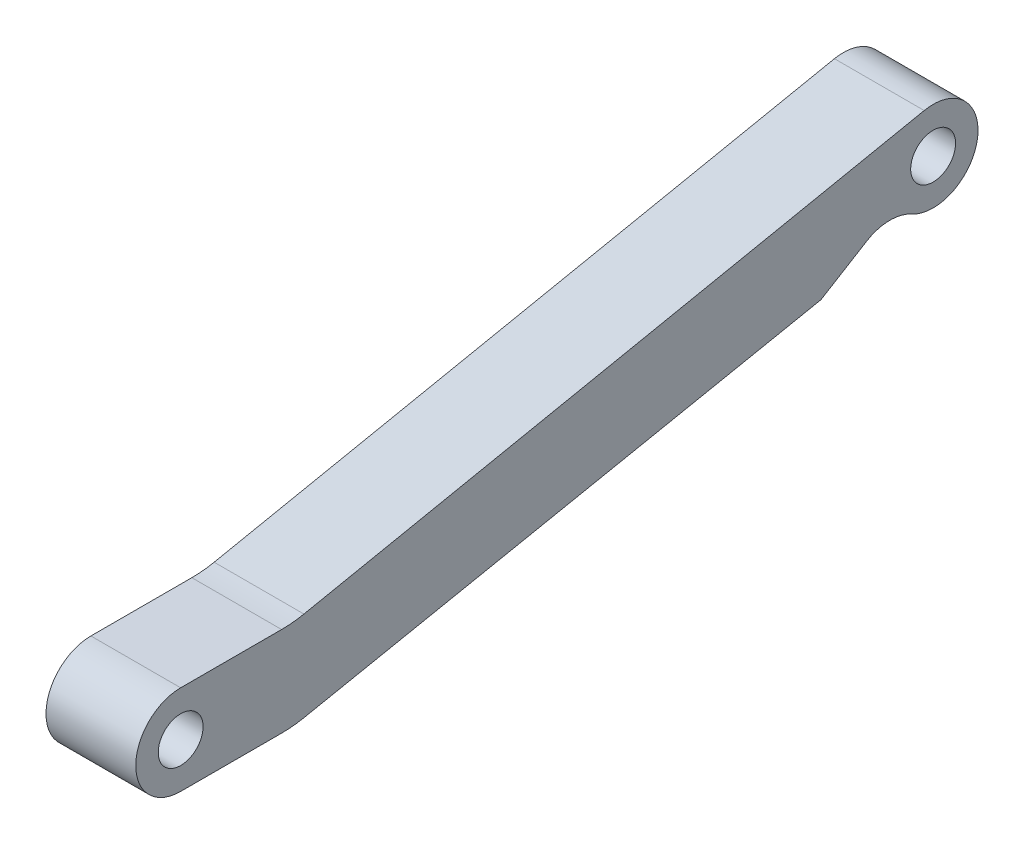
ISO-10303-21;
HEADER;
FILE_DESCRIPTION(('STEP AP214'),'2;1');
FILE_NAME('part.step','',(''),(''),'','','');
FILE_SCHEMA(('AUTOMOTIVE_DESIGN { 1 0 10303 214 1 1 1 1 }'));
ENDSEC;
DATA;
#1=APPLICATION_CONTEXT('core data for automotive mechanical design processes');
#2=APPLICATION_PROTOCOL_DEFINITION('international standard','automotive_design',2000,#1);
#3=PRODUCT_CONTEXT('',#1,'mechanical');
#4=PRODUCT('Part','Part','',(#3));
#5=PRODUCT_RELATED_PRODUCT_CATEGORY('part','',(#4));
#6=PRODUCT_DEFINITION_FORMATION('','',#4);
#7=PRODUCT_DEFINITION_CONTEXT('part definition',#1,'design');
#8=PRODUCT_DEFINITION('design','',#6,#7);
#9=PRODUCT_DEFINITION_SHAPE('','',#8);
#10=(LENGTH_UNIT() NAMED_UNIT(*) SI_UNIT(.MILLI.,.METRE.));
#11=(NAMED_UNIT(*) PLANE_ANGLE_UNIT() SI_UNIT($,.RADIAN.));
#12=(NAMED_UNIT(*) SI_UNIT($,.STERADIAN.) SOLID_ANGLE_UNIT());
#13=UNCERTAINTY_MEASURE_WITH_UNIT(LENGTH_MEASURE(1.E-05),#10,'distance_accuracy_value','');
#14=(GEOMETRIC_REPRESENTATION_CONTEXT(3) GLOBAL_UNCERTAINTY_ASSIGNED_CONTEXT((#13)) GLOBAL_UNIT_ASSIGNED_CONTEXT((#10,
#11,#12)) REPRESENTATION_CONTEXT('',''));
#15=CARTESIAN_POINT('',(0.,0.,0.));
#16=DIRECTION('',(0.,0.,1.));
#17=DIRECTION('',(1.,0.,0.));
#18=AXIS2_PLACEMENT_3D('',#15,#16,#17);
#19=CARTESIAN_POINT('',(-2.,-1.75836402671256,-31.6061609564246));
#20=DIRECTION('',(1.,0.,0.));
#21=DIRECTION('',(0.,0.,-1.));
#22=AXIS2_PLACEMENT_3D('',#19,#20,#21);
#23=CYLINDRICAL_SURFACE('',#22,2.);
#24=DIRECTION('',(1.,0.,0.));
#25=VECTOR('',#24,1.);
#26=CARTESIAN_POINT('',(-2.,-0.00418201335628172,-32.5668094165895));
#27=LINE('',#26,#25);
#28=CARTESIAN_POINT('',(-2.,-0.00418201335628172,-32.5668094165895));
#29=VERTEX_POINT('',#28);
#30=CARTESIAN_POINT('',(2.,-0.00418201335628172,-32.5668094165895));
#31=VERTEX_POINT('',#30);
#32=EDGE_CURVE('E43',#29,#31,#27,.T.);
#33=ORIENTED_EDGE('',*,*,#32,.T.);
#34=CARTESIAN_POINT('',(2.,-1.75836402671256,-31.6061609564246));
#35=DIRECTION('',(1.,0.,0.));
#36=DIRECTION('',(0.,0.,-1.));
#37=AXIS2_PLACEMENT_3D('',#34,#35,#36);
#38=CIRCLE('',#37,2.);
#39=CARTESIAN_POINT('',(2.,-0.049795877872523,-30.5665481050374));
#40=VERTEX_POINT('',#39);
#41=EDGE_CURVE('E120',#31,#40,#38,.T.);
#42=ORIENTED_EDGE('',*,*,#41,.T.);
#43=DIRECTION('',(1.,0.,0.));
#44=VECTOR('',#43,1.);
#45=CARTESIAN_POINT('',(-2.,-0.049795877872523,-30.5665481050374));
#46=LINE('',#45,#44);
#47=CARTESIAN_POINT('',(-2.,-0.049795877872523,-30.5665481050374));
#48=VERTEX_POINT('',#47);
#49=EDGE_CURVE('E11',#48,#40,#46,.T.);
#50=ORIENTED_EDGE('',*,*,#49,.F.);
#51=CARTESIAN_POINT('',(-2.,-1.75836402671256,-31.6061609564246));
#52=DIRECTION('',(1.,0.,0.));
#53=DIRECTION('',(0.,0.,-1.));
#54=AXIS2_PLACEMENT_3D('',#51,#52,#53);
#55=CIRCLE('',#54,2.);
#56=EDGE_CURVE('E56',#29,#48,#55,.T.);
#57=ORIENTED_EDGE('',*,*,#56,.F.);
#58=EDGE_LOOP('',(#33,#42,#50,#57));
#59=FACE_BOUND('',#58,.T.);
#60=ADVANCED_FACE('F39',(#59),#23,.F.);
#61=CARTESIAN_POINT('',(-2.,-13.6097943165567,-8.28115465328903));
#62=DIRECTION('',(0.,-0.854284074420021,-0.519806425693573));
#63=DIRECTION('',(0.,0.519806425693573,-0.854284074420021));
#64=AXIS2_PLACEMENT_3D('',#61,#62,#63);
#65=PLANE('',#64);
#66=ORIENTED_EDGE('',*,*,#49,.T.);
#67=DIRECTION('',(0.,0.519806425693573,-0.854284074420021));
#68=VECTOR('',#67,1.);
#69=CARTESIAN_POINT('',(2.,-13.6097943165567,-8.28115465328903));
#70=LINE('',#69,#68);
#71=CARTESIAN_POINT('',(2.,-1.29052157435709,-28.5274578767545));
#72=VERTEX_POINT('',#71);
#73=EDGE_CURVE('E137',#72,#40,#70,.T.);
#74=ORIENTED_EDGE('',*,*,#73,.F.);
#75=DIRECTION('',(1.,0.,0.));
#76=VECTOR('',#75,1.);
#77=CARTESIAN_POINT('',(-2.,-1.29052157435709,-28.5274578767545));
#78=LINE('',#77,#76);
#79=CARTESIAN_POINT('',(-2.,-1.29052157435709,-28.5274578767545));
#80=VERTEX_POINT('',#79);
#81=EDGE_CURVE('E48',#80,#72,#78,.T.);
#82=ORIENTED_EDGE('',*,*,#81,.F.);
#83=DIRECTION('',(0.,0.519806425693573,-0.854284074420021));
#84=VECTOR('',#83,1.);
#85=CARTESIAN_POINT('',(-2.,-13.6097943165567,-8.28115465328903));
#86=LINE('',#85,#84);
#87=EDGE_CURVE('E124',#80,#48,#86,.T.);
#88=ORIENTED_EDGE('',*,*,#87,.T.);
#89=EDGE_LOOP('',(#66,#74,#82,#88));
#90=FACE_BOUND('',#89,.T.);
#91=ADVANCED_FACE('F232',(#90),#65,.T.);
#92=CARTESIAN_POINT('',(-2.,-6.73114503050437,-1.34736963368891));
#93=DIRECTION('',(0.,-0.980548709004733,-0.196275900887377));
#94=DIRECTION('',(0.,0.196275900887377,-0.980548709004733));
#95=AXIS2_PLACEMENT_3D('',#92,#93,#94);
#96=PLANE('',#95);
#97=ORIENTED_EDGE('',*,*,#81,.T.);
#98=DIRECTION('',(0.,0.196275900887377,-0.980548709004733));
#99=VECTOR('',#98,1.);
#100=CARTESIAN_POINT('',(2.,-6.73114503050437,-1.34736963368891));
#101=LINE('',#100,#99);
#102=CARTESIAN_POINT('',(2.,-5.90274354502367,-5.48587060835417));
#103=VERTEX_POINT('',#102);
#104=EDGE_CURVE('E161',#103,#72,#101,.T.);
#105=ORIENTED_EDGE('',*,*,#104,.F.);
#106=DIRECTION('',(1.,0.,0.));
#107=VECTOR('',#106,1.);
#108=CARTESIAN_POINT('',(-2.,-5.90274354502367,-5.48587060835417));
#109=LINE('',#108,#107);
#110=CARTESIAN_POINT('',(-2.,-5.90274354502367,-5.48587060835417));
#111=VERTEX_POINT('',#110);
#112=EDGE_CURVE('E192',#111,#103,#109,.T.);
#113=ORIENTED_EDGE('',*,*,#112,.F.);
#114=DIRECTION('',(0.,0.196275900887377,-0.980548709004733));
#115=VECTOR('',#114,1.);
#116=CARTESIAN_POINT('',(-2.,-6.73114503050437,-1.34736963368891));
#117=LINE('',#116,#115);
#118=EDGE_CURVE('E188',#111,#80,#117,.T.);
#119=ORIENTED_EDGE('',*,*,#118,.T.);
#120=EDGE_LOOP('',(#97,#105,#113,#119));
#121=FACE_BOUND('',#120,.T.);
#122=ADVANCED_FACE('F230',(#121),#96,.T.);
#123=CARTESIAN_POINT('',(-2.,-1.,-4.50449110391729));
#124=DIRECTION('',(1.,0.,0.));
#125=DIRECTION('',(0.,0.,-1.));
#126=AXIS2_PLACEMENT_3D('',#123,#124,#125);
#127=CYLINDRICAL_SURFACE('',#126,5.);
#128=ORIENTED_EDGE('',*,*,#112,.T.);
#129=CARTESIAN_POINT('',(2.,-1.,-4.50449110391729));
#130=DIRECTION('',(1.,0.,0.));
#131=DIRECTION('',(0.,0.,-1.));
#132=AXIS2_PLACEMENT_3D('',#129,#130,#131);
#133=CIRCLE('',#132,5.);
#134=CARTESIAN_POINT('',(2.,-6.,-4.50449110391729));
#135=VERTEX_POINT('',#134);
#136=EDGE_CURVE('E158',#135,#103,#133,.T.);
#137=ORIENTED_EDGE('',*,*,#136,.F.);
#138=DIRECTION('',(1.,0.,0.));
#139=VECTOR('',#138,1.);
#140=CARTESIAN_POINT('',(-2.,-6.,-4.50449110391729));
#141=LINE('',#140,#139);
#142=CARTESIAN_POINT('',(-2.,-6.,-4.50449110391729));
#143=VERTEX_POINT('',#142);
#144=EDGE_CURVE('E194',#143,#135,#141,.T.);
#145=ORIENTED_EDGE('',*,*,#144,.F.);
#146=CARTESIAN_POINT('',(-2.,-1.,-4.50449110391729));
#147=DIRECTION('',(1.,0.,0.));
#148=DIRECTION('',(0.,0.,-1.));
#149=AXIS2_PLACEMENT_3D('',#146,#147,#148);
#150=CIRCLE('',#149,5.);
#151=EDGE_CURVE('E185',#143,#111,#150,.T.);
#152=ORIENTED_EDGE('',*,*,#151,.T.);
#153=EDGE_LOOP('',(#128,#137,#145,#152));
#154=FACE_BOUND('',#153,.T.);
#155=ADVANCED_FACE('F227',(#154),#127,.T.);
#156=CARTESIAN_POINT('',(-2.,-6.,0.));
#157=DIRECTION('',(0.,-1.,0.));
#158=DIRECTION('',(0.,0.,-1.));
#159=AXIS2_PLACEMENT_3D('',#156,#157,#158);
#160=PLANE('',#159);
#161=ORIENTED_EDGE('',*,*,#144,.T.);
#162=DIRECTION('',(0.,0.,-1.));
#163=VECTOR('',#162,1.);
#164=CARTESIAN_POINT('',(2.,-6.,0.));
#165=LINE('',#164,#163);
#166=CARTESIAN_POINT('',(2.,-6.,0.));
#167=VERTEX_POINT('',#166);
#168=EDGE_CURVE('E155',#167,#135,#165,.T.);
#169=ORIENTED_EDGE('',*,*,#168,.F.);
#170=DIRECTION('',(1.,0.,0.));
#171=VECTOR('',#170,1.);
#172=CARTESIAN_POINT('',(-2.,-6.,0.));
#173=LINE('',#172,#171);
#174=CARTESIAN_POINT('',(-2.,-6.,0.));
#175=VERTEX_POINT('',#174);
#176=EDGE_CURVE('E196',#175,#167,#173,.T.);
#177=ORIENTED_EDGE('',*,*,#176,.F.);
#178=DIRECTION('',(0.,0.,-1.));
#179=VECTOR('',#178,1.);
#180=CARTESIAN_POINT('',(-2.,-6.,0.));
#181=LINE('',#180,#179);
#182=EDGE_CURVE('E182',#175,#143,#181,.T.);
#183=ORIENTED_EDGE('',*,*,#182,.T.);
#184=EDGE_LOOP('',(#161,#169,#177,#183));
#185=FACE_BOUND('',#184,.T.);
#186=ADVANCED_FACE('F223',(#185),#160,.T.);
#187=CARTESIAN_POINT('',(-2.,-4.,0.));
#188=DIRECTION('',(1.,0.,0.));
#189=DIRECTION('',(0.,0.,-1.));
#190=AXIS2_PLACEMENT_3D('',#187,#188,#189);
#191=CYLINDRICAL_SURFACE('',#190,2.);
#192=ORIENTED_EDGE('',*,*,#176,.T.);
#193=CARTESIAN_POINT('',(2.,-4.,0.));
#194=DIRECTION('',(1.,0.,0.));
#195=DIRECTION('',(0.,0.,-1.));
#196=AXIS2_PLACEMENT_3D('',#193,#194,#195);
#197=CIRCLE('',#196,2.);
#198=CARTESIAN_POINT('',(2.,-2.,0.));
#199=VERTEX_POINT('',#198);
#200=EDGE_CURVE('E152',#199,#167,#197,.T.);
#201=ORIENTED_EDGE('',*,*,#200,.F.);
#202=DIRECTION('',(1.,0.,0.));
#203=VECTOR('',#202,1.);
#204=CARTESIAN_POINT('',(-2.,-2.,0.));
#205=LINE('',#204,#203);
#206=CARTESIAN_POINT('',(-2.,-2.,0.));
#207=VERTEX_POINT('',#206);
#208=EDGE_CURVE('E198',#207,#199,#205,.T.);
#209=ORIENTED_EDGE('',*,*,#208,.F.);
#210=CARTESIAN_POINT('',(-2.,-4.,0.));
#211=DIRECTION('',(1.,0.,0.));
#212=DIRECTION('',(0.,0.,-1.));
#213=AXIS2_PLACEMENT_3D('',#210,#211,#212);
#214=CIRCLE('',#213,2.);
#215=EDGE_CURVE('E179',#207,#175,#214,.T.);
#216=ORIENTED_EDGE('',*,*,#215,.T.);
#217=EDGE_LOOP('',(#192,#201,#209,#216));
#218=FACE_BOUND('',#217,.T.);
#219=ADVANCED_FACE('F220',(#218),#191,.T.);
#220=CARTESIAN_POINT('',(-2.,-2.,0.));
#221=DIRECTION('',(0.,-1.,0.));
#222=DIRECTION('',(0.,0.,-1.));
#223=AXIS2_PLACEMENT_3D('',#220,#221,#222);
#224=PLANE('',#223);
#225=ORIENTED_EDGE('',*,*,#208,.T.);
#226=DIRECTION('',(0.,0.,-1.));
#227=VECTOR('',#226,1.);
#228=CARTESIAN_POINT('',(2.,-2.,0.));
#229=LINE('',#228,#227);
#230=CARTESIAN_POINT('',(2.,-2.,-4.49764758497376));
#231=VERTEX_POINT('',#230);
#232=EDGE_CURVE('E149',#199,#231,#229,.T.);
#233=ORIENTED_EDGE('',*,*,#232,.T.);
#234=DIRECTION('',(1.,0.,0.));
#235=VECTOR('',#234,1.);
#236=CARTESIAN_POINT('',(-2.,-2.,-4.49764758497376));
#237=LINE('',#236,#235);
#238=CARTESIAN_POINT('',(-2.,-2.,-4.49764758497376));
#239=VERTEX_POINT('',#238);
#240=EDGE_CURVE('E200',#239,#231,#237,.T.);
#241=ORIENTED_EDGE('',*,*,#240,.F.);
#242=DIRECTION('',(0.,0.,-1.));
#243=VECTOR('',#242,1.);
#244=CARTESIAN_POINT('',(-2.,-2.,0.));
#245=LINE('',#244,#243);
#246=EDGE_CURVE('E177',#207,#239,#245,.T.);
#247=ORIENTED_EDGE('',*,*,#246,.F.);
#248=EDGE_LOOP('',(#225,#233,#241,#247));
#249=FACE_BOUND('',#248,.T.);
#250=ADVANCED_FACE('F215',(#249),#224,.F.);
#251=CARTESIAN_POINT('',(-2.,3.,-4.49764758497376));
#252=DIRECTION('',(1.,0.,0.));
#253=DIRECTION('',(0.,0.,-1.));
#254=AXIS2_PLACEMENT_3D('',#251,#252,#253);
#255=CYLINDRICAL_SURFACE('',#254,5.);
#256=ORIENTED_EDGE('',*,*,#240,.T.);
#257=CARTESIAN_POINT('',(2.,3.,-4.49764758497376));
#258=DIRECTION('',(1.,0.,0.));
#259=DIRECTION('',(0.,0.,-1.));
#260=AXIS2_PLACEMENT_3D('',#257,#258,#259);
#261=CIRCLE('',#260,5.);
#262=CARTESIAN_POINT('',(2.,-1.9000655901546,-5.49231195660013));
#263=VERTEX_POINT('',#262);
#264=EDGE_CURVE('E146',#231,#263,#261,.T.);
#265=ORIENTED_EDGE('',*,*,#264,.T.);
#266=DIRECTION('',(1.,0.,0.));
#267=VECTOR('',#266,1.);
#268=CARTESIAN_POINT('',(-2.,-1.9000655901546,-5.49231195660013));
#269=LINE('',#268,#267);
#270=CARTESIAN_POINT('',(-2.,-1.9000655901546,-5.49231195660013));
#271=VERTEX_POINT('',#270);
#272=EDGE_CURVE('E202',#271,#263,#269,.T.);
#273=ORIENTED_EDGE('',*,*,#272,.F.);
#274=CARTESIAN_POINT('',(-2.,3.,-4.49764758497376));
#275=DIRECTION('',(1.,0.,0.));
#276=DIRECTION('',(0.,0.,-1.));
#277=AXIS2_PLACEMENT_3D('',#274,#275,#276);
#278=CIRCLE('',#277,5.);
#279=EDGE_CURVE('E175',#239,#271,#278,.T.);
#280=ORIENTED_EDGE('',*,*,#279,.F.);
#281=EDGE_LOOP('',(#256,#265,#273,#280));
#282=FACE_BOUND('',#281,.T.);
#283=ADVANCED_FACE('F211',(#282),#255,.F.);
#284=CARTESIAN_POINT('',(-2.,-2.89563555525718,-0.587785095329304));
#285=DIRECTION('',(0.,-0.980013118030919,-0.198932874325274));
#286=DIRECTION('',(0.,0.198932874325274,-0.98001311803092));
#287=AXIS2_PLACEMENT_3D('',#284,#285,#286);
#288=PLANE('',#287);
#289=ORIENTED_EDGE('',*,*,#272,.T.);
#290=DIRECTION('',(0.,0.198932874325274,-0.98001311803092));
#291=VECTOR('',#290,1.);
#292=CARTESIAN_POINT('',(2.,-2.89563555525718,-0.587785095329304));
#293=LINE('',#292,#291);
#294=CARTESIAN_POINT('',(2.,3.71002623606184,-33.1295921281039));
#295=VERTEX_POINT('',#294);
#296=EDGE_CURVE('E132',#263,#295,#293,.T.);
#297=ORIENTED_EDGE('',*,*,#296,.T.);
#298=DIRECTION('',(1.,0.,0.));
#299=VECTOR('',#298,1.);
#300=CARTESIAN_POINT('',(-2.,3.71002623606184,-33.1295921281039));
#301=LINE('',#300,#299);
#302=CARTESIAN_POINT('',(-2.,3.71002623606184,-33.1295921281039));
#303=VERTEX_POINT('',#302);
#304=EDGE_CURVE('E123',#303,#295,#301,.T.);
#305=ORIENTED_EDGE('',*,*,#304,.F.);
#306=DIRECTION('',(0.,0.198932874325274,-0.98001311803092));
#307=VECTOR('',#306,1.);
#308=CARTESIAN_POINT('',(-2.,-2.89563555525718,-0.587785095329304));
#309=LINE('',#308,#307);
#310=EDGE_CURVE('E173',#271,#303,#309,.T.);
#311=ORIENTED_EDGE('',*,*,#310,.F.);
#312=EDGE_LOOP('',(#289,#297,#305,#311));
#313=FACE_BOUND('',#312,.T.);
#314=ADVANCED_FACE('F206',(#313),#288,.F.);
#315=CARTESIAN_POINT('',(-2.,1.75,-33.5274578767545));
#316=DIRECTION('',(1.,0.,0.));
#317=DIRECTION('',(0.,0.,-1.));
#318=AXIS2_PLACEMENT_3D('',#315,#316,#317);
#319=CYLINDRICAL_SURFACE('',#318,0.999999999999998);
#320=CARTESIAN_POINT('',(-2.,1.75,-33.5274578767545));
#321=DIRECTION('',(1.,0.,0.));
#322=DIRECTION('',(0.,0.,-1.));
#323=AXIS2_PLACEMENT_3D('',#320,#321,#322);
#324=CIRCLE('',#323,0.999999999999998);
#325=CARTESIAN_POINT('',(-2.,1.75,-34.5274578767545));
#326=VERTEX_POINT('',#325);
#327=EDGE_CURVE('E167',#326,#326,#324,.T.);
#328=ORIENTED_EDGE('',*,*,#327,.F.);
#329=EDGE_LOOP('',(#328));
#330=FACE_BOUND('',#329,.T.);
#331=CARTESIAN_POINT('',(2.,1.75,-33.5274578767545));
#332=DIRECTION('',(1.,0.,0.));
#333=DIRECTION('',(0.,0.,-1.));
#334=AXIS2_PLACEMENT_3D('',#331,#332,#333);
#335=CIRCLE('',#334,0.999999999999998);
#336=CARTESIAN_POINT('',(2.,1.75,-34.5274578767545));
#337=VERTEX_POINT('',#336);
#338=EDGE_CURVE('E138',#337,#337,#335,.T.);
#339=ORIENTED_EDGE('',*,*,#338,.T.);
#340=EDGE_LOOP('',(#339));
#341=FACE_BOUND('',#340,.T.);
#342=ADVANCED_FACE('F252',(#330,#341),#319,.F.);
#343=CARTESIAN_POINT('',(-2.,-4.,0.));
#344=DIRECTION('',(1.,0.,0.));
#345=DIRECTION('',(0.,0.,-1.));
#346=AXIS2_PLACEMENT_3D('',#343,#344,#345);
#347=CYLINDRICAL_SURFACE('',#346,1.);
#348=CARTESIAN_POINT('',(-2.,-4.,0.));
#349=DIRECTION('',(1.,0.,0.));
#350=DIRECTION('',(0.,0.,-1.));
#351=AXIS2_PLACEMENT_3D('',#348,#349,#350);
#352=CIRCLE('',#351,1.);
#353=CARTESIAN_POINT('',(-2.,-4.,-0.999999999999951));
#354=VERTEX_POINT('',#353);
#355=EDGE_CURVE('E164',#354,#354,#352,.T.);
#356=ORIENTED_EDGE('',*,*,#355,.F.);
#357=EDGE_LOOP('',(#356));
#358=FACE_BOUND('',#357,.T.);
#359=CARTESIAN_POINT('',(2.,-4.,0.));
#360=DIRECTION('',(1.,0.,0.));
#361=DIRECTION('',(0.,0.,-1.));
#362=AXIS2_PLACEMENT_3D('',#359,#360,#361);
#363=CIRCLE('',#362,1.);
#364=CARTESIAN_POINT('',(2.,-4.,-0.999999999999951));
#365=VERTEX_POINT('',#364);
#366=EDGE_CURVE('E141',#365,#365,#363,.T.);
#367=ORIENTED_EDGE('',*,*,#366,.T.);
#368=EDGE_LOOP('',(#367));
#369=FACE_BOUND('',#368,.T.);
#370=ADVANCED_FACE('F41',(#358,#369),#347,.F.);
#371=CARTESIAN_POINT('',(-2.,1.75,-33.5274578767545));
#372=DIRECTION('',(1.,0.,0.));
#373=DIRECTION('',(0.,0.,-1.));
#374=AXIS2_PLACEMENT_3D('',#371,#372,#373);
#375=CYLINDRICAL_SURFACE('',#374,2.);
#376=ORIENTED_EDGE('',*,*,#304,.T.);
#377=CARTESIAN_POINT('',(2.,1.75,-33.5274578767545));
#378=DIRECTION('',(1.,0.,0.));
#379=DIRECTION('',(0.,0.,-1.));
#380=AXIS2_PLACEMENT_3D('',#377,#378,#379);
#381=CIRCLE('',#380,2.);
#382=EDGE_CURVE('E126',#31,#295,#381,.T.);
#383=ORIENTED_EDGE('',*,*,#382,.F.);
#384=ORIENTED_EDGE('',*,*,#32,.F.);
#385=CARTESIAN_POINT('',(-2.,1.75,-33.5274578767545));
#386=DIRECTION('',(1.,0.,0.));
#387=DIRECTION('',(0.,0.,-1.));
#388=AXIS2_PLACEMENT_3D('',#385,#386,#387);
#389=CIRCLE('',#388,2.);
#390=EDGE_CURVE('E171',#29,#303,#389,.T.);
#391=ORIENTED_EDGE('',*,*,#390,.T.);
#392=EDGE_LOOP('',(#376,#383,#384,#391));
#393=FACE_BOUND('',#392,.T.);
#394=ADVANCED_FACE('F127',(#393),#375,.T.);
#395=CARTESIAN_POINT('',(-2.,0.,0.));
#396=DIRECTION('',(1.,0.,0.));
#397=DIRECTION('',(0.,0.,-1.));
#398=AXIS2_PLACEMENT_3D('',#395,#396,#397);
#399=PLANE('',#398);
#400=ORIENTED_EDGE('',*,*,#355,.T.);
#401=EDGE_LOOP('',(#400));
#402=FACE_BOUND('',#401,.T.);
#403=ORIENTED_EDGE('',*,*,#327,.T.);
#404=EDGE_LOOP('',(#403));
#405=FACE_BOUND('',#404,.T.);
#406=ORIENTED_EDGE('',*,*,#56,.T.);
#407=ORIENTED_EDGE('',*,*,#87,.F.);
#408=ORIENTED_EDGE('',*,*,#118,.F.);
#409=ORIENTED_EDGE('',*,*,#151,.F.);
#410=ORIENTED_EDGE('',*,*,#182,.F.);
#411=ORIENTED_EDGE('',*,*,#215,.F.);
#412=ORIENTED_EDGE('',*,*,#246,.T.);
#413=ORIENTED_EDGE('',*,*,#279,.T.);
#414=ORIENTED_EDGE('',*,*,#310,.T.);
#415=ORIENTED_EDGE('',*,*,#390,.F.);
#416=EDGE_LOOP('',(#406,#407,#408,#409,#410,#411,#412,#413,#414,#415));
#417=FACE_BOUND('',#416,.T.);
#418=ADVANCED_FACE('F233',(#402,#405,#417),#399,.F.);
#419=CARTESIAN_POINT('',(2.,0.,0.));
#420=DIRECTION('',(1.,0.,0.));
#421=DIRECTION('',(0.,0.,-1.));
#422=AXIS2_PLACEMENT_3D('',#419,#420,#421);
#423=PLANE('',#422);
#424=ORIENTED_EDGE('',*,*,#366,.F.);
#425=EDGE_LOOP('',(#424));
#426=FACE_BOUND('',#425,.T.);
#427=ORIENTED_EDGE('',*,*,#338,.F.);
#428=EDGE_LOOP('',(#427));
#429=FACE_BOUND('',#428,.T.);
#430=ORIENTED_EDGE('',*,*,#41,.F.);
#431=ORIENTED_EDGE('',*,*,#382,.T.);
#432=ORIENTED_EDGE('',*,*,#296,.F.);
#433=ORIENTED_EDGE('',*,*,#264,.F.);
#434=ORIENTED_EDGE('',*,*,#232,.F.);
#435=ORIENTED_EDGE('',*,*,#200,.T.);
#436=ORIENTED_EDGE('',*,*,#168,.T.);
#437=ORIENTED_EDGE('',*,*,#136,.T.);
#438=ORIENTED_EDGE('',*,*,#104,.T.);
#439=ORIENTED_EDGE('',*,*,#73,.T.);
#440=EDGE_LOOP('',(#430,#431,#432,#433,#434,#435,#436,#437,#438,#439));
#441=FACE_BOUND('',#440,.T.);
#442=ADVANCED_FACE('F135',(#426,#429,#441),#423,.T.);
#443=CLOSED_SHELL('',(#60,#91,#122,#155,#186,#219,#250,#283,#314,#342,#370,#394,#418,#442));
#444=MANIFOLD_SOLID_BREP('B2',#443);
#445=ADVANCED_BREP_SHAPE_REPRESENTATION('',(#18,#444),#14);
#446=SHAPE_DEFINITION_REPRESENTATION(#9,#445);
ENDSEC;
END-ISO-10303-21;
